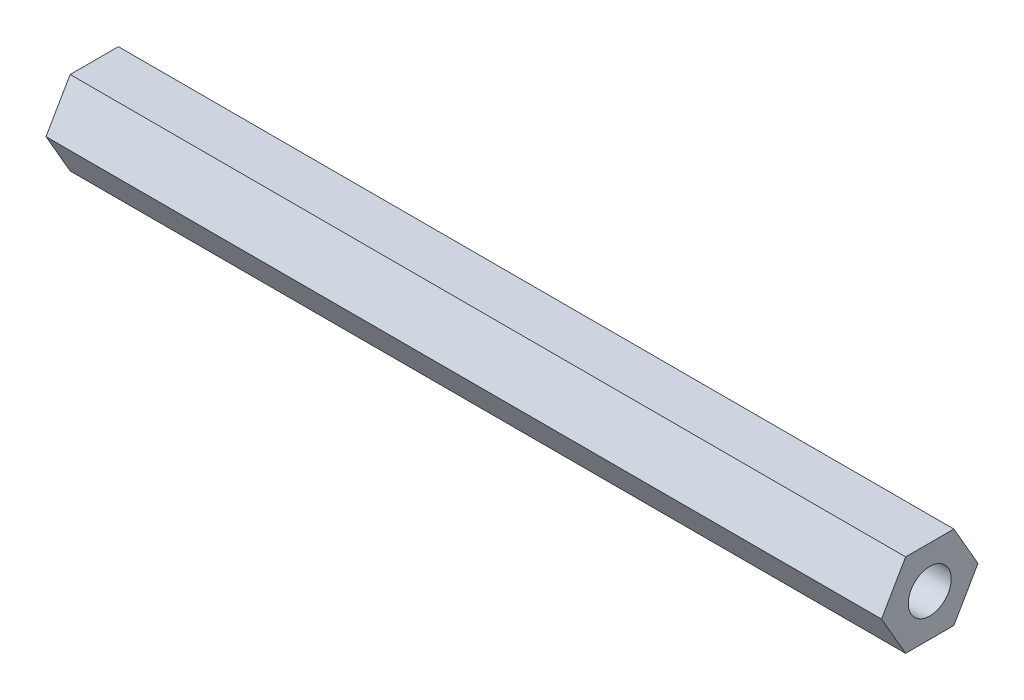
ISO-10303-21;
HEADER;
FILE_DESCRIPTION(('STEP AP214'),'2;1');
FILE_NAME('part.step','',(''),(''),'','','');
FILE_SCHEMA(('AUTOMOTIVE_DESIGN { 1 0 10303 214 1 1 1 1 }'));
ENDSEC;
DATA;
#1=APPLICATION_CONTEXT('core data for automotive mechanical design processes');
#2=APPLICATION_PROTOCOL_DEFINITION('international standard','automotive_design',2000,#1);
#3=PRODUCT_CONTEXT('',#1,'mechanical');
#4=PRODUCT('Part','Part','',(#3));
#5=PRODUCT_RELATED_PRODUCT_CATEGORY('part','',(#4));
#6=PRODUCT_DEFINITION_FORMATION('','',#4);
#7=PRODUCT_DEFINITION_CONTEXT('part definition',#1,'design');
#8=PRODUCT_DEFINITION('design','',#6,#7);
#9=PRODUCT_DEFINITION_SHAPE('','',#8);
#10=(LENGTH_UNIT() NAMED_UNIT(*) SI_UNIT(.MILLI.,.METRE.));
#11=(NAMED_UNIT(*) PLANE_ANGLE_UNIT() SI_UNIT($,.RADIAN.));
#12=(NAMED_UNIT(*) SI_UNIT($,.STERADIAN.) SOLID_ANGLE_UNIT());
#13=UNCERTAINTY_MEASURE_WITH_UNIT(LENGTH_MEASURE(1.E-05),#10,'distance_accuracy_value','');
#14=(GEOMETRIC_REPRESENTATION_CONTEXT(3) GLOBAL_UNCERTAINTY_ASSIGNED_CONTEXT((#13)) GLOBAL_UNIT_ASSIGNED_CONTEXT((#10,
#11,#12)) REPRESENTATION_CONTEXT('',''));
#15=CARTESIAN_POINT('',(0.,0.,0.));
#16=DIRECTION('',(0.,0.,1.));
#17=DIRECTION('',(1.,0.,0.));
#18=AXIS2_PLACEMENT_3D('',#15,#16,#17);
#19=CARTESIAN_POINT('',(127.,6.35,-3.66617420935412));
#20=DIRECTION('',(0.,-1.,0.));
#21=DIRECTION('',(0.,0.,-1.));
#22=AXIS2_PLACEMENT_3D('',#19,#20,#21);
#23=PLANE('',#22);
#24=DIRECTION('',(0.,0.,1.));
#25=VECTOR('',#24,1.);
#26=CARTESIAN_POINT('',(0.,6.35,-3.66617420935412));
#27=LINE('',#26,#25);
#28=CARTESIAN_POINT('',(0.,6.35,-3.66617420935412));
#29=VERTEX_POINT('',#28);
#30=CARTESIAN_POINT('',(0.,6.35,3.66617420935412));
#31=VERTEX_POINT('',#30);
#32=EDGE_CURVE('E119',#29,#31,#27,.T.);
#33=ORIENTED_EDGE('',*,*,#32,.T.);
#34=DIRECTION('',(-1.,0.,0.));
#35=VECTOR('',#34,1.);
#36=CARTESIAN_POINT('',(127.,6.35,3.66617420935412));
#37=LINE('',#36,#35);
#38=CARTESIAN_POINT('',(127.,6.35,3.66617420935412));
#39=VERTEX_POINT('',#38);
#40=EDGE_CURVE('E11',#39,#31,#37,.T.);
#41=ORIENTED_EDGE('',*,*,#40,.F.);
#42=DIRECTION('',(0.,0.,1.));
#43=VECTOR('',#42,1.);
#44=CARTESIAN_POINT('',(127.,6.35,-3.66617420935412));
#45=LINE('',#44,#43);
#46=CARTESIAN_POINT('',(127.,6.35,-3.66617420935412));
#47=VERTEX_POINT('',#46);
#48=EDGE_CURVE('E130',#47,#39,#45,.T.);
#49=ORIENTED_EDGE('',*,*,#48,.F.);
#50=DIRECTION('',(-1.,0.,0.));
#51=VECTOR('',#50,1.);
#52=CARTESIAN_POINT('',(127.,6.35,-3.66617420935412));
#53=LINE('',#52,#51);
#54=EDGE_CURVE('E115',#47,#29,#53,.T.);
#55=ORIENTED_EDGE('',*,*,#54,.T.);
#56=EDGE_LOOP('',(#33,#41,#49,#55));
#57=FACE_BOUND('',#56,.T.);
#58=ADVANCED_FACE('F35',(#57),#23,.F.);
#59=CARTESIAN_POINT('',(127.,6.35,3.66617420935412));
#60=DIRECTION('',(0.,-0.5,-0.866025403784439));
#61=DIRECTION('',(0.,0.866025403784439,-0.5));
#62=AXIS2_PLACEMENT_3D('',#59,#60,#61);
#63=PLANE('',#62);
#64=DIRECTION('',(0.,-0.866025403784439,0.499999999999999));
#65=VECTOR('',#64,1.);
#66=CARTESIAN_POINT('',(0.,6.35,3.66617420935412));
#67=LINE('',#66,#65);
#68=CARTESIAN_POINT('',(0.,0.,7.33234841870824));
#69=VERTEX_POINT('',#68);
#70=EDGE_CURVE('E122',#31,#69,#67,.T.);
#71=ORIENTED_EDGE('',*,*,#70,.T.);
#72=DIRECTION('',(-1.,0.,0.));
#73=VECTOR('',#72,1.);
#74=CARTESIAN_POINT('',(127.,0.,7.33234841870824));
#75=LINE('',#74,#73);
#76=CARTESIAN_POINT('',(127.,0.,7.33234841870824));
#77=VERTEX_POINT('',#76);
#78=EDGE_CURVE('E43',#77,#69,#75,.T.);
#79=ORIENTED_EDGE('',*,*,#78,.F.);
#80=DIRECTION('',(0.,-0.866025403784439,0.499999999999999));
#81=VECTOR('',#80,1.);
#82=CARTESIAN_POINT('',(127.,6.35,3.66617420935412));
#83=LINE('',#82,#81);
#84=EDGE_CURVE('E88',#39,#77,#83,.T.);
#85=ORIENTED_EDGE('',*,*,#84,.F.);
#86=ORIENTED_EDGE('',*,*,#40,.T.);
#87=EDGE_LOOP('',(#71,#79,#85,#86));
#88=FACE_BOUND('',#87,.T.);
#89=ADVANCED_FACE('F156',(#88),#63,.F.);
#90=CARTESIAN_POINT('',(127.,0.,7.33234841870824));
#91=DIRECTION('',(0.,0.5,-0.866025403784438));
#92=DIRECTION('',(0.,0.866025403784438,0.5));
#93=AXIS2_PLACEMENT_3D('',#90,#91,#92);
#94=PLANE('',#93);
#95=DIRECTION('',(0.,-0.866025403784438,-0.5));
#96=VECTOR('',#95,1.);
#97=CARTESIAN_POINT('',(0.,0.,7.33234841870824));
#98=LINE('',#97,#96);
#99=CARTESIAN_POINT('',(0.,-6.35,3.66617420935412));
#100=VERTEX_POINT('',#99);
#101=EDGE_CURVE('E125',#69,#100,#98,.T.);
#102=ORIENTED_EDGE('',*,*,#101,.T.);
#103=DIRECTION('',(-1.,0.,0.));
#104=VECTOR('',#103,1.);
#105=CARTESIAN_POINT('',(127.,-6.35,3.66617420935412));
#106=LINE('',#105,#104);
#107=CARTESIAN_POINT('',(127.,-6.35,3.66617420935412));
#108=VERTEX_POINT('',#107);
#109=EDGE_CURVE('E110',#108,#100,#106,.T.);
#110=ORIENTED_EDGE('',*,*,#109,.F.);
#111=DIRECTION('',(0.,-0.866025403784438,-0.5));
#112=VECTOR('',#111,1.);
#113=CARTESIAN_POINT('',(127.,0.,7.33234841870824));
#114=LINE('',#113,#112);
#115=EDGE_CURVE('E101',#77,#108,#114,.T.);
#116=ORIENTED_EDGE('',*,*,#115,.F.);
#117=ORIENTED_EDGE('',*,*,#78,.T.);
#118=EDGE_LOOP('',(#102,#110,#116,#117));
#119=FACE_BOUND('',#118,.T.);
#120=ADVANCED_FACE('F136',(#119),#94,.F.);
#121=CARTESIAN_POINT('',(127.,-6.35,3.66617420935412));
#122=DIRECTION('',(0.,1.,0.));
#123=DIRECTION('',(0.,0.,1.));
#124=AXIS2_PLACEMENT_3D('',#121,#122,#123);
#125=PLANE('',#124);
#126=DIRECTION('',(0.,0.,-1.));
#127=VECTOR('',#126,1.);
#128=CARTESIAN_POINT('',(0.,-6.35,3.66617420935412));
#129=LINE('',#128,#127);
#130=CARTESIAN_POINT('',(0.,-6.35,-3.66617420935412));
#131=VERTEX_POINT('',#130);
#132=EDGE_CURVE('E109',#100,#131,#129,.T.);
#133=ORIENTED_EDGE('',*,*,#132,.T.);
#134=DIRECTION('',(-1.,0.,0.));
#135=VECTOR('',#134,1.);
#136=CARTESIAN_POINT('',(127.,-6.35,-3.66617420935412));
#137=LINE('',#136,#135);
#138=CARTESIAN_POINT('',(127.,-6.35,-3.66617420935412));
#139=VERTEX_POINT('',#138);
#140=EDGE_CURVE('E106',#139,#131,#137,.T.);
#141=ORIENTED_EDGE('',*,*,#140,.F.);
#142=DIRECTION('',(0.,0.,-1.));
#143=VECTOR('',#142,1.);
#144=CARTESIAN_POINT('',(127.,-6.35,3.66617420935412));
#145=LINE('',#144,#143);
#146=EDGE_CURVE('E95',#108,#139,#145,.T.);
#147=ORIENTED_EDGE('',*,*,#146,.F.);
#148=ORIENTED_EDGE('',*,*,#109,.T.);
#149=EDGE_LOOP('',(#133,#141,#147,#148));
#150=FACE_BOUND('',#149,.T.);
#151=ADVANCED_FACE('F107',(#150),#125,.F.);
#152=CARTESIAN_POINT('',(127.,-6.35,-3.66617420935412));
#153=DIRECTION('',(0.,0.5,0.866025403784439));
#154=DIRECTION('',(0.,-0.866025403784439,0.5));
#155=AXIS2_PLACEMENT_3D('',#152,#153,#154);
#156=PLANE('',#155);
#157=DIRECTION('',(0.,0.866025403784439,-0.5));
#158=VECTOR('',#157,1.);
#159=CARTESIAN_POINT('',(0.,-6.35,-3.66617420935412));
#160=LINE('',#159,#158);
#161=CARTESIAN_POINT('',(0.,0.,-7.33234841870825));
#162=VERTEX_POINT('',#161);
#163=EDGE_CURVE('E74',#131,#162,#160,.T.);
#164=ORIENTED_EDGE('',*,*,#163,.T.);
#165=DIRECTION('',(-1.,0.,0.));
#166=VECTOR('',#165,1.);
#167=CARTESIAN_POINT('',(127.,0.,-7.33234841870825));
#168=LINE('',#167,#166);
#169=CARTESIAN_POINT('',(127.,0.,-7.33234841870825));
#170=VERTEX_POINT('',#169);
#171=EDGE_CURVE('E111',#170,#162,#168,.T.);
#172=ORIENTED_EDGE('',*,*,#171,.F.);
#173=DIRECTION('',(0.,0.866025403784439,-0.5));
#174=VECTOR('',#173,1.);
#175=CARTESIAN_POINT('',(127.,-6.35,-3.66617420935412));
#176=LINE('',#175,#174);
#177=EDGE_CURVE('E99',#139,#170,#176,.T.);
#178=ORIENTED_EDGE('',*,*,#177,.F.);
#179=ORIENTED_EDGE('',*,*,#140,.T.);
#180=EDGE_LOOP('',(#164,#172,#178,#179));
#181=FACE_BOUND('',#180,.T.);
#182=ADVANCED_FACE('F113',(#181),#156,.F.);
#183=CARTESIAN_POINT('',(127.,0.,-7.33234841870825));
#184=DIRECTION('',(0.,-0.5,0.866025403784438));
#185=DIRECTION('',(0.,-0.866025403784439,-0.5));
#186=AXIS2_PLACEMENT_3D('',#183,#184,#185);
#187=PLANE('',#186);
#188=DIRECTION('',(0.,0.866025403784438,0.5));
#189=VECTOR('',#188,1.);
#190=CARTESIAN_POINT('',(0.,0.,-7.33234841870825));
#191=LINE('',#190,#189);
#192=EDGE_CURVE('E80',#162,#29,#191,.T.);
#193=ORIENTED_EDGE('',*,*,#192,.T.);
#194=ORIENTED_EDGE('',*,*,#54,.F.);
#195=DIRECTION('',(0.,0.866025403784438,0.5));
#196=VECTOR('',#195,1.);
#197=CARTESIAN_POINT('',(127.,0.,-7.33234841870825));
#198=LINE('',#197,#196);
#199=EDGE_CURVE('E51',#170,#47,#198,.T.);
#200=ORIENTED_EDGE('',*,*,#199,.F.);
#201=ORIENTED_EDGE('',*,*,#171,.T.);
#202=EDGE_LOOP('',(#193,#194,#200,#201));
#203=FACE_BOUND('',#202,.T.);
#204=ADVANCED_FACE('F143',(#203),#187,.F.);
#205=CARTESIAN_POINT('',(127.,0.,0.));
#206=DIRECTION('',(1.,0.,0.));
#207=DIRECTION('',(0.,0.,-1.));
#208=AXIS2_PLACEMENT_3D('',#205,#206,#207);
#209=PLANE('',#208);
#210=CARTESIAN_POINT('',(127.,0.,0.));
#211=DIRECTION('',(1.,0.,0.));
#212=DIRECTION('',(0.,0.,-1.));
#213=AXIS2_PLACEMENT_3D('',#210,#211,#212);
#214=CIRCLE('',#213,3.2639);
#215=CARTESIAN_POINT('',(127.,0.,-3.2639));
#216=VERTEX_POINT('',#215);
#217=EDGE_CURVE('E214',#216,#216,#214,.T.);
#218=ORIENTED_EDGE('',*,*,#217,.F.);
#219=EDGE_LOOP('',(#218));
#220=FACE_BOUND('',#219,.T.);
#221=ORIENTED_EDGE('',*,*,#48,.T.);
#222=ORIENTED_EDGE('',*,*,#84,.T.);
#223=ORIENTED_EDGE('',*,*,#115,.T.);
#224=ORIENTED_EDGE('',*,*,#146,.T.);
#225=ORIENTED_EDGE('',*,*,#177,.T.);
#226=ORIENTED_EDGE('',*,*,#199,.T.);
#227=EDGE_LOOP('',(#221,#222,#223,#224,#225,#226));
#228=FACE_BOUND('',#227,.T.);
#229=ADVANCED_FACE('F97',(#220,#228),#209,.T.);
#230=CARTESIAN_POINT('',(0.,0.,0.));
#231=DIRECTION('',(1.,0.,0.));
#232=DIRECTION('',(0.,0.,-1.));
#233=AXIS2_PLACEMENT_3D('',#230,#231,#232);
#234=PLANE('',#233);
#235=ORIENTED_EDGE('',*,*,#32,.F.);
#236=ORIENTED_EDGE('',*,*,#192,.F.);
#237=ORIENTED_EDGE('',*,*,#163,.F.);
#238=ORIENTED_EDGE('',*,*,#132,.F.);
#239=ORIENTED_EDGE('',*,*,#101,.F.);
#240=ORIENTED_EDGE('',*,*,#70,.F.);
#241=EDGE_LOOP('',(#235,#236,#237,#238,#239,#240));
#242=FACE_BOUND('',#241,.T.);
#243=ADVANCED_FACE('F139',(#242),#234,.F.);
#244=CARTESIAN_POINT('',(120.65,0.,0.));
#245=DIRECTION('',(1.,0.,0.));
#246=DIRECTION('',(0.,0.,-1.));
#247=AXIS2_PLACEMENT_3D('',#244,#245,#246);
#248=CYLINDRICAL_SURFACE('',#247,3.2639);
#249=CARTESIAN_POINT('',(120.65,0.,0.));
#250=DIRECTION('',(1.,0.,0.));
#251=DIRECTION('',(0.,0.,-1.));
#252=AXIS2_PLACEMENT_3D('',#249,#250,#251);
#253=CIRCLE('',#252,3.2639);
#254=CARTESIAN_POINT('',(120.65,0.,-3.2639));
#255=VERTEX_POINT('',#254);
#256=EDGE_CURVE('E123',#255,#255,#253,.T.);
#257=ORIENTED_EDGE('',*,*,#256,.F.);
#258=EDGE_LOOP('',(#257));
#259=FACE_BOUND('',#258,.T.);
#260=ORIENTED_EDGE('',*,*,#217,.T.);
#261=EDGE_LOOP('',(#260));
#262=FACE_BOUND('',#261,.T.);
#263=ADVANCED_FACE('F187',(#259,#262),#248,.F.);
#264=CARTESIAN_POINT('',(120.65,0.,0.));
#265=DIRECTION('',(1.,0.,0.));
#266=DIRECTION('',(0.,0.,-1.));
#267=AXIS2_PLACEMENT_3D('',#264,#265,#266);
#268=PLANE('',#267);
#269=ORIENTED_EDGE('',*,*,#256,.T.);
#270=EDGE_LOOP('',(#269));
#271=FACE_BOUND('',#270,.T.);
#272=ADVANCED_FACE('F198',(#271),#268,.T.);
#273=CLOSED_SHELL('',(#58,#89,#120,#151,#182,#204,#229,#243,#263,#272));
#274=MANIFOLD_SOLID_BREP('B2',#273);
#275=ADVANCED_BREP_SHAPE_REPRESENTATION('',(#18,#274),#14);
#276=SHAPE_DEFINITION_REPRESENTATION(#9,#275);
ENDSEC;
END-ISO-10303-21;
